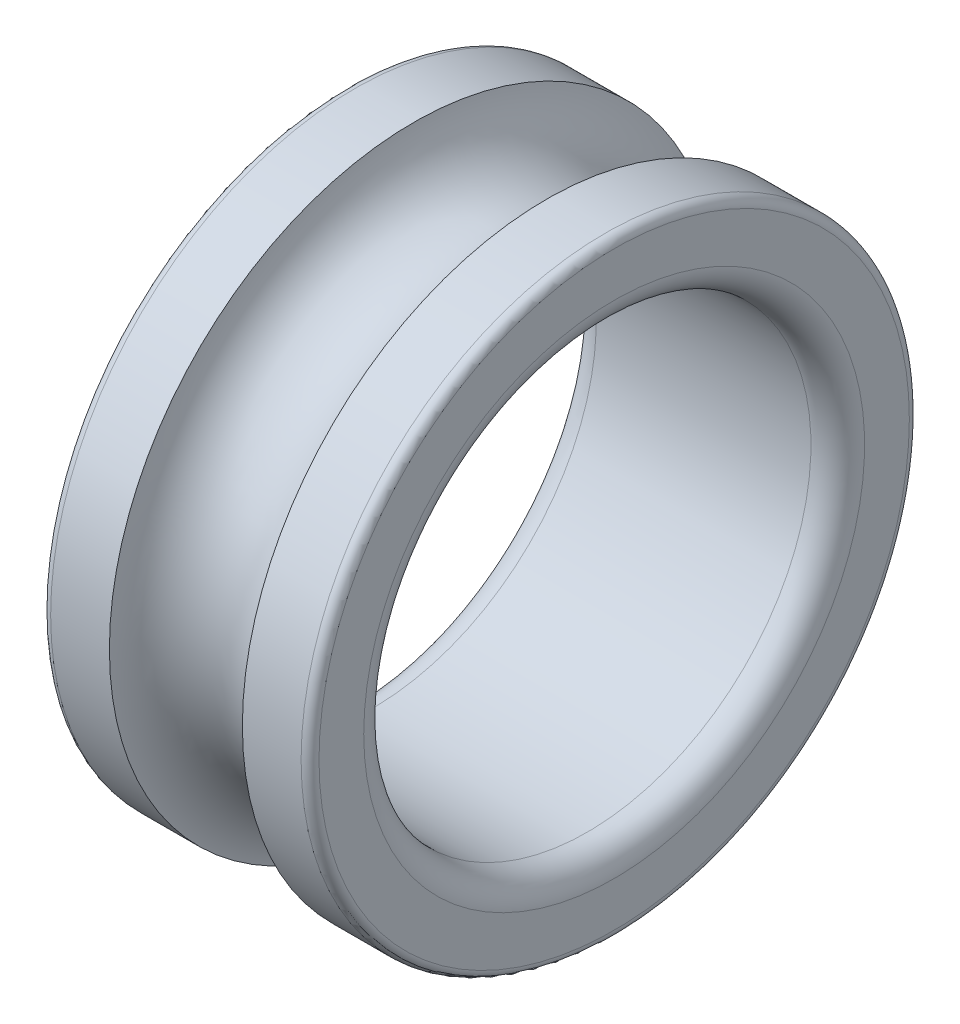
ISO-10303-21;
HEADER;
FILE_DESCRIPTION(('STEP AP214'),'2;1');
FILE_NAME('part.step','',(''),(''),'','','');
FILE_SCHEMA(('AUTOMOTIVE_DESIGN { 1 0 10303 214 1 1 1 1 }'));
ENDSEC;
DATA;
#1=APPLICATION_CONTEXT('core data for automotive mechanical design processes');
#2=APPLICATION_PROTOCOL_DEFINITION('international standard','automotive_design',2000,#1);
#3=PRODUCT_CONTEXT('',#1,'mechanical');
#4=PRODUCT('Part','Part','',(#3));
#5=PRODUCT_RELATED_PRODUCT_CATEGORY('part','',(#4));
#6=PRODUCT_DEFINITION_FORMATION('','',#4);
#7=PRODUCT_DEFINITION_CONTEXT('part definition',#1,'design');
#8=PRODUCT_DEFINITION('design','',#6,#7);
#9=PRODUCT_DEFINITION_SHAPE('','',#8);
#10=(LENGTH_UNIT() NAMED_UNIT(*) SI_UNIT(.MILLI.,.METRE.));
#11=(NAMED_UNIT(*) PLANE_ANGLE_UNIT() SI_UNIT($,.RADIAN.));
#12=(NAMED_UNIT(*) SI_UNIT($,.STERADIAN.) SOLID_ANGLE_UNIT());
#13=UNCERTAINTY_MEASURE_WITH_UNIT(LENGTH_MEASURE(1.E-05),#10,'distance_accuracy_value','');
#14=(GEOMETRIC_REPRESENTATION_CONTEXT(3) GLOBAL_UNCERTAINTY_ASSIGNED_CONTEXT((#13)) GLOBAL_UNIT_ASSIGNED_CONTEXT((#10,
#11,#12)) REPRESENTATION_CONTEXT('',''));
#15=CARTESIAN_POINT('',(0.,0.,0.));
#16=DIRECTION('',(0.,0.,1.));
#17=DIRECTION('',(1.,0.,0.));
#18=AXIS2_PLACEMENT_3D('',#15,#16,#17);
#19=CARTESIAN_POINT('',(2.35,0.,0.));
#20=DIRECTION('',(-1.,0.,0.));
#21=DIRECTION('',(0.,0.,1.));
#22=AXIS2_PLACEMENT_3D('',#19,#20,#21);
#23=TOROIDAL_SURFACE('',#22,3.3,0.099999999999997);
#24=CARTESIAN_POINT('',(2.35,0.,0.));
#25=DIRECTION('',(-1.,0.,0.));
#26=DIRECTION('',(0.,0.,1.));
#27=AXIS2_PLACEMENT_3D('',#24,#25,#26);
#28=CIRCLE('',#27,3.4);
#29=CARTESIAN_POINT('',(2.35,0.,3.4));
#30=VERTEX_POINT('',#29);
#31=EDGE_CURVE('E10',#30,#30,#28,.T.);
#32=ORIENTED_EDGE('',*,*,#31,.T.);
#33=EDGE_LOOP('',(#32));
#34=FACE_BOUND('',#33,.T.);
#35=CARTESIAN_POINT('',(2.25,0.,0.));
#36=DIRECTION('',(-1.,0.,0.));
#37=DIRECTION('',(0.,0.,1.));
#38=AXIS2_PLACEMENT_3D('',#35,#36,#37);
#39=CIRCLE('',#38,3.3);
#40=CARTESIAN_POINT('',(2.25,0.,3.3));
#41=VERTEX_POINT('',#40);
#42=EDGE_CURVE('E66',#41,#41,#39,.T.);
#43=ORIENTED_EDGE('',*,*,#42,.F.);
#44=EDGE_LOOP('',(#43));
#45=FACE_BOUND('',#44,.T.);
#46=ADVANCED_FACE('F32',(#34,#45),#23,.T.);
#47=CARTESIAN_POINT('',(7.0012539936204,0.,0.));
#48=DIRECTION('',(-1.,0.,0.));
#49=DIRECTION('',(0.,0.,1.));
#50=AXIS2_PLACEMENT_3D('',#47,#48,#49);
#51=CYLINDRICAL_SURFACE('',#50,3.4);
#52=CARTESIAN_POINT('',(3.00669656263407,0.,0.));
#53=DIRECTION('',(-1.,0.,0.));
#54=DIRECTION('',(0.,0.,1.));
#55=AXIS2_PLACEMENT_3D('',#52,#53,#54);
#56=CIRCLE('',#55,3.4);
#57=CARTESIAN_POINT('',(3.00669656263407,0.,3.4));
#58=VERTEX_POINT('',#57);
#59=EDGE_CURVE('E38',#58,#58,#56,.T.);
#60=ORIENTED_EDGE('',*,*,#59,.T.);
#61=EDGE_LOOP('',(#60));
#62=FACE_BOUND('',#61,.T.);
#63=ORIENTED_EDGE('',*,*,#31,.F.);
#64=EDGE_LOOP('',(#63));
#65=FACE_BOUND('',#64,.T.);
#66=ADVANCED_FACE('F74',(#62,#65),#51,.T.);
#67=CARTESIAN_POINT('',(3.75,0.,0.));
#68=DIRECTION('',(-1.,0.,0.));
#69=DIRECTION('',(0.,0.,1.));
#70=AXIS2_PLACEMENT_3D('',#67,#68,#69);
#71=TOROIDAL_SURFACE('',#70,3.5,0.75);
#72=CARTESIAN_POINT('',(4.49330343736592,0.,0.));
#73=DIRECTION('',(-1.,0.,0.));
#74=DIRECTION('',(0.,0.,1.));
#75=AXIS2_PLACEMENT_3D('',#72,#73,#74);
#76=CIRCLE('',#75,3.4);
#77=CARTESIAN_POINT('',(4.49330343736592,0.,3.4));
#78=VERTEX_POINT('',#77);
#79=EDGE_CURVE('E42',#78,#78,#76,.T.);
#80=ORIENTED_EDGE('',*,*,#79,.T.);
#81=EDGE_LOOP('',(#80));
#82=FACE_BOUND('',#81,.T.);
#83=ORIENTED_EDGE('',*,*,#59,.F.);
#84=EDGE_LOOP('',(#83));
#85=FACE_BOUND('',#84,.T.);
#86=ADVANCED_FACE('F78',(#82,#85),#71,.F.);
#87=CARTESIAN_POINT('',(7.0012539936204,0.,0.));
#88=DIRECTION('',(-1.,0.,0.));
#89=DIRECTION('',(0.,0.,1.));
#90=AXIS2_PLACEMENT_3D('',#87,#88,#89);
#91=CYLINDRICAL_SURFACE('',#90,3.4);
#92=CARTESIAN_POINT('',(5.15,0.,0.));
#93=DIRECTION('',(-1.,0.,0.));
#94=DIRECTION('',(0.,0.,1.));
#95=AXIS2_PLACEMENT_3D('',#92,#93,#94);
#96=CIRCLE('',#95,3.4);
#97=CARTESIAN_POINT('',(5.15,0.,3.4));
#98=VERTEX_POINT('',#97);
#99=EDGE_CURVE('E46',#98,#98,#96,.T.);
#100=ORIENTED_EDGE('',*,*,#99,.T.);
#101=EDGE_LOOP('',(#100));
#102=FACE_BOUND('',#101,.T.);
#103=ORIENTED_EDGE('',*,*,#79,.F.);
#104=EDGE_LOOP('',(#103));
#105=FACE_BOUND('',#104,.T.);
#106=ADVANCED_FACE('F82',(#102,#105),#91,.T.);
#107=CARTESIAN_POINT('',(5.15,0.,0.));
#108=DIRECTION('',(-1.,0.,0.));
#109=DIRECTION('',(0.,0.,1.));
#110=AXIS2_PLACEMENT_3D('',#107,#108,#109);
#111=TOROIDAL_SURFACE('',#110,3.3,0.0999999999999994);
#112=CARTESIAN_POINT('',(5.25,0.,0.));
#113=DIRECTION('',(-1.,0.,0.));
#114=DIRECTION('',(0.,0.,1.));
#115=AXIS2_PLACEMENT_3D('',#112,#113,#114);
#116=CIRCLE('',#115,3.3);
#117=CARTESIAN_POINT('',(5.25,0.,3.3));
#118=VERTEX_POINT('',#117);
#119=EDGE_CURVE('E51',#118,#118,#116,.T.);
#120=ORIENTED_EDGE('',*,*,#119,.T.);
#121=EDGE_LOOP('',(#120));
#122=FACE_BOUND('',#121,.T.);
#123=ORIENTED_EDGE('',*,*,#99,.F.);
#124=EDGE_LOOP('',(#123));
#125=FACE_BOUND('',#124,.T.);
#126=ADVANCED_FACE('F89',(#122,#125),#111,.T.);
#127=CARTESIAN_POINT('',(5.25,3.3,0.));
#128=DIRECTION('',(1.,0.,0.));
#129=DIRECTION('',(0.,0.,-1.));
#130=AXIS2_PLACEMENT_3D('',#127,#128,#129);
#131=PLANE('',#130);
#132=CARTESIAN_POINT('',(5.25,0.,0.));
#133=DIRECTION('',(-1.,0.,0.));
#134=DIRECTION('',(0.,0.,1.));
#135=AXIS2_PLACEMENT_3D('',#132,#133,#134);
#136=CIRCLE('',#135,2.8);
#137=CARTESIAN_POINT('',(5.25,0.,2.8));
#138=VERTEX_POINT('',#137);
#139=EDGE_CURVE('E54',#138,#138,#136,.T.);
#140=ORIENTED_EDGE('',*,*,#139,.T.);
#141=EDGE_LOOP('',(#140));
#142=FACE_BOUND('',#141,.T.);
#143=ORIENTED_EDGE('',*,*,#119,.F.);
#144=EDGE_LOOP('',(#143));
#145=FACE_BOUND('',#144,.T.);
#146=ADVANCED_FACE('F93',(#142,#145),#131,.T.);
#147=CARTESIAN_POINT('',(4.95,0.,0.));
#148=DIRECTION('',(-1.,0.,0.));
#149=DIRECTION('',(0.,0.,1.));
#150=AXIS2_PLACEMENT_3D('',#147,#148,#149);
#151=TOROIDAL_SURFACE('',#150,2.8,0.300000000000002);
#152=CARTESIAN_POINT('',(4.95,0.,0.));
#153=DIRECTION('',(-1.,0.,0.));
#154=DIRECTION('',(0.,0.,1.));
#155=AXIS2_PLACEMENT_3D('',#152,#153,#154);
#156=CIRCLE('',#155,2.5);
#157=CARTESIAN_POINT('',(4.95,0.,2.5));
#158=VERTEX_POINT('',#157);
#159=EDGE_CURVE('E57',#158,#158,#156,.T.);
#160=ORIENTED_EDGE('',*,*,#159,.T.);
#161=EDGE_LOOP('',(#160));
#162=FACE_BOUND('',#161,.T.);
#163=ORIENTED_EDGE('',*,*,#139,.F.);
#164=EDGE_LOOP('',(#163));
#165=FACE_BOUND('',#164,.T.);
#166=ADVANCED_FACE('F97',(#162,#165),#151,.T.);
#167=CARTESIAN_POINT('',(7.0012539936204,0.,0.));
#168=DIRECTION('',(-1.,0.,0.));
#169=DIRECTION('',(0.,0.,1.));
#170=AXIS2_PLACEMENT_3D('',#167,#168,#169);
#171=CYLINDRICAL_SURFACE('',#170,2.5);
#172=CARTESIAN_POINT('',(2.55,0.,0.));
#173=DIRECTION('',(-1.,0.,0.));
#174=DIRECTION('',(0.,0.,1.));
#175=AXIS2_PLACEMENT_3D('',#172,#173,#174);
#176=CIRCLE('',#175,2.5);
#177=CARTESIAN_POINT('',(2.55,0.,2.5));
#178=VERTEX_POINT('',#177);
#179=EDGE_CURVE('E60',#178,#178,#176,.T.);
#180=ORIENTED_EDGE('',*,*,#179,.T.);
#181=EDGE_LOOP('',(#180));
#182=FACE_BOUND('',#181,.T.);
#183=ORIENTED_EDGE('',*,*,#159,.F.);
#184=EDGE_LOOP('',(#183));
#185=FACE_BOUND('',#184,.T.);
#186=ADVANCED_FACE('F101',(#182,#185),#171,.F.);
#187=CARTESIAN_POINT('',(2.55,0.,0.));
#188=DIRECTION('',(-1.,0.,0.));
#189=DIRECTION('',(0.,0.,1.));
#190=AXIS2_PLACEMENT_3D('',#187,#188,#189);
#191=TOROIDAL_SURFACE('',#190,2.8,0.300000000000002);
#192=CARTESIAN_POINT('',(2.25,0.,0.));
#193=DIRECTION('',(-1.,0.,0.));
#194=DIRECTION('',(0.,0.,1.));
#195=AXIS2_PLACEMENT_3D('',#192,#193,#194);
#196=CIRCLE('',#195,2.8);
#197=CARTESIAN_POINT('',(2.25,0.,2.8));
#198=VERTEX_POINT('',#197);
#199=EDGE_CURVE('E63',#198,#198,#196,.T.);
#200=ORIENTED_EDGE('',*,*,#199,.T.);
#201=EDGE_LOOP('',(#200));
#202=FACE_BOUND('',#201,.T.);
#203=ORIENTED_EDGE('',*,*,#179,.F.);
#204=EDGE_LOOP('',(#203));
#205=FACE_BOUND('',#204,.T.);
#206=ADVANCED_FACE('F105',(#202,#205),#191,.T.);
#207=CARTESIAN_POINT('',(2.25,2.8,0.));
#208=DIRECTION('',(-1.,0.,0.));
#209=DIRECTION('',(0.,0.,1.));
#210=AXIS2_PLACEMENT_3D('',#207,#208,#209);
#211=PLANE('',#210);
#212=ORIENTED_EDGE('',*,*,#42,.T.);
#213=EDGE_LOOP('',(#212));
#214=FACE_BOUND('',#213,.T.);
#215=ORIENTED_EDGE('',*,*,#199,.F.);
#216=EDGE_LOOP('',(#215));
#217=FACE_BOUND('',#216,.T.);
#218=ADVANCED_FACE('F70',(#214,#217),#211,.T.);
#219=CLOSED_SHELL('',(#46,#66,#86,#106,#126,#146,#166,#186,#206,#218));
#220=MANIFOLD_SOLID_BREP('B2',#219);
#221=ADVANCED_BREP_SHAPE_REPRESENTATION('',(#18,#220),#14);
#222=SHAPE_DEFINITION_REPRESENTATION(#9,#221);
ENDSEC;
END-ISO-10303-21;
